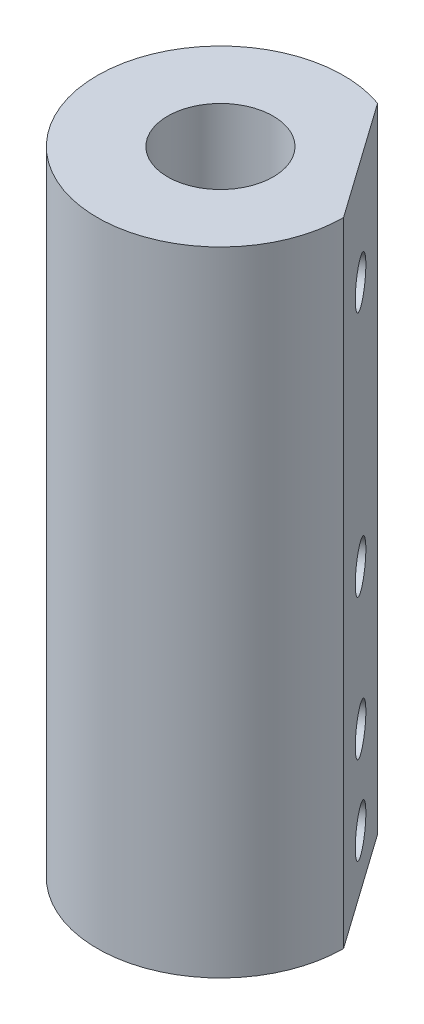
ISO-10303-21;
HEADER;
FILE_DESCRIPTION(('STEP AP214'),'2;1');
FILE_NAME('part.step','',(''),(''),'','','');
FILE_SCHEMA(('AUTOMOTIVE_DESIGN { 1 0 10303 214 1 1 1 1 }'));
ENDSEC;
DATA;
#1=APPLICATION_CONTEXT('core data for automotive mechanical design processes');
#2=APPLICATION_PROTOCOL_DEFINITION('international standard','automotive_design',2000,#1);
#3=PRODUCT_CONTEXT('',#1,'mechanical');
#4=PRODUCT('Part','Part','',(#3));
#5=PRODUCT_RELATED_PRODUCT_CATEGORY('part','',(#4));
#6=PRODUCT_DEFINITION_FORMATION('','',#4);
#7=PRODUCT_DEFINITION_CONTEXT('part definition',#1,'design');
#8=PRODUCT_DEFINITION('design','',#6,#7);
#9=PRODUCT_DEFINITION_SHAPE('','',#8);
#10=(LENGTH_UNIT() NAMED_UNIT(*) SI_UNIT(.MILLI.,.METRE.));
#11=(NAMED_UNIT(*) PLANE_ANGLE_UNIT() SI_UNIT($,.RADIAN.));
#12=(NAMED_UNIT(*) SI_UNIT($,.STERADIAN.) SOLID_ANGLE_UNIT());
#13=UNCERTAINTY_MEASURE_WITH_UNIT(LENGTH_MEASURE(1.E-05),#10,'distance_accuracy_value','');
#14=(GEOMETRIC_REPRESENTATION_CONTEXT(3) GLOBAL_UNCERTAINTY_ASSIGNED_CONTEXT((#13)) GLOBAL_UNIT_ASSIGNED_CONTEXT((#10,
#11,#12)) REPRESENTATION_CONTEXT('',''));
#15=CARTESIAN_POINT('',(0.,0.,0.));
#16=DIRECTION('',(0.,0.,1.));
#17=DIRECTION('',(1.,0.,0.));
#18=AXIS2_PLACEMENT_3D('',#15,#16,#17);
#19=CARTESIAN_POINT('',(0.,57.15,0.));
#20=DIRECTION('',(0.,-1.,0.));
#21=DIRECTION('',(0.,0.,-1.));
#22=AXIS2_PLACEMENT_3D('',#19,#20,#21);
#23=CYLINDRICAL_SURFACE('',#22,3.175);
#24=CARTESIAN_POINT('',(0.879250836057139,12.7,-3.0508266039375));
#25=CARTESIAN_POINT('',(0.879266784529314,12.7986159473622,-3.05082741825468));
#26=CARTESIAN_POINT('',(0.888428439740588,12.8973863136503,-3.04822737365737));
#27=CARTESIAN_POINT('',(0.923910178826769,13.091598658126,-3.03765206808218));
#28=CARTESIAN_POINT('',(0.950276878018773,13.1870308496049,-3.02966220193752));
#29=CARTESIAN_POINT('',(1.01694977886354,13.3711669372845,-3.00793000143587));
#30=CARTESIAN_POINT('',(1.05713499111702,13.4599213412824,-2.99423738531754));
#31=CARTESIAN_POINT('',(1.14830461055607,13.6302890678506,-2.9604696740733));
#32=CARTESIAN_POINT('',(1.19928931231204,13.7119021955473,-2.94039440484457));
#33=CARTESIAN_POINT('',(1.31664450245552,13.8777109327323,-2.88992633161334));
#34=CARTESIAN_POINT('',(1.3841614711888,13.9607841510718,-2.85851068301641));
#35=CARTESIAN_POINT('',(1.52607451934385,14.1158637848927,-2.78533787167219));
#36=CARTESIAN_POINT('',(1.60047650304798,14.1878605581883,-2.74357178037398));
#37=CARTESIAN_POINT('',(1.76228841849776,14.3273519414227,-2.64293235087655));
#38=CARTESIAN_POINT('',(1.85018477727017,14.3932555481156,-2.58260305190722));
#39=CARTESIAN_POINT('',(2.02622061822568,14.5067737625616,-2.44690798700951));
#40=CARTESIAN_POINT('',(2.11435977201634,14.5544064793801,-2.37155722269306));
#41=CARTESIAN_POINT('',(2.27732897128609,14.6248156680887,-2.21491374353619));
#42=CARTESIAN_POINT('',(2.35260108756851,14.6496268735302,-2.13500398755379));
#43=CARTESIAN_POINT('',(2.49583254065029,14.6806159105589,-1.96562906684928));
#44=CARTESIAN_POINT('',(2.56379949232779,14.6868133303414,-1.87617404983686));
#45=CARTESIAN_POINT('',(2.68105369073802,14.6806353432718,-1.70352281645355));
#46=CARTESIAN_POINT('',(2.73162369725391,14.6706409401224,-1.62109787251304));
#47=CARTESIAN_POINT('',(2.82401535494036,14.6369611623231,-1.45418662193724));
#48=CARTESIAN_POINT('',(2.86583634456912,14.6132747528852,-1.36970015996277));
#49=CARTESIAN_POINT('',(2.94051987378886,14.5532415070335,-1.2010443984891));
#50=CARTESIAN_POINT('',(2.97335910629797,14.5168622793237,-1.11687647274812));
#51=CARTESIAN_POINT('',(3.0303869763192,14.4328058510239,-0.951343288549882));
#52=CARTESIAN_POINT('',(3.05457363988127,14.3851260765079,-0.869978673445757));
#53=CARTESIAN_POINT('',(3.09774714873017,14.2731677875432,-0.702138099001987));
#54=CARTESIAN_POINT('',(3.11571231445628,14.2075620300607,-0.616286143258725));
#55=CARTESIAN_POINT('',(3.14362236637916,14.0650398463811,-0.452932923975716));
#56=CARTESIAN_POINT('',(3.1535554585757,13.9881069829628,-0.37544408456706));
#57=CARTESIAN_POINT('',(3.16828033405091,13.8133048236951,-0.222032336448539));
#58=CARTESIAN_POINT('',(3.17223132034705,13.7140134331351,-0.147635389316901));
#59=CARTESIAN_POINT('',(3.17562165900396,13.5038367850943,-0.0174781506000808));
#60=CARTESIAN_POINT('',(3.17506936332696,13.3929733665289,0.0383164415941777));
#61=CARTESIAN_POINT('',(3.17310443267602,13.1924910728781,0.11438178712268));
#62=CARTESIAN_POINT('',(3.17195628892221,13.1049538468026,0.140136162555728));
#63=CARTESIAN_POINT('',(3.17014106555317,12.926829637871,0.176567343436816));
#64=CARTESIAN_POINT('',(3.16947332934425,12.8362469953517,0.187264747107328));
#65=CARTESIAN_POINT('',(3.16915525520783,12.6543932196396,0.192587434728846));
#66=CARTESIAN_POINT('',(3.16950724874707,12.563120985331,0.187175887080329));
#67=CARTESIAN_POINT('',(3.17095413282316,12.382848327613,0.160745728688529));
#68=CARTESIAN_POINT('',(3.17204963851579,12.2938498487465,0.139714193157351));
#69=CARTESIAN_POINT('',(3.17399673251353,12.1218033156128,0.0843306899287901));
#70=CARTESIAN_POINT('',(3.17485204397106,12.0386813560861,0.0502040171406935));
#71=CARTESIAN_POINT('',(3.17511335816301,11.8780126063908,-0.0292420249921355));
#72=CARTESIAN_POINT('',(3.17451884589173,11.8004678074111,-0.0745653664729504));
#73=CARTESIAN_POINT('',(3.17022370171469,11.6374766628064,-0.183949204004283));
#74=CARTESIAN_POINT('',(3.16595325039273,11.5533367782666,-0.249934168104891));
#75=CARTESIAN_POINT('',(3.15149296269693,11.3947812292528,-0.392228879682924));
#76=CARTESIAN_POINT('',(3.14129695891541,11.3203757955474,-0.468549320912708));
#77=CARTESIAN_POINT('',(3.11083966016658,11.1712640965889,-0.642061000534193));
#78=CARTESIAN_POINT('',(3.0892270035168,11.0984211657503,-0.74063674743561));
#79=CARTESIAN_POINT('',(3.03299369059539,10.969516015147,-0.944864305588989));
#80=CARTESIAN_POINT('',(2.99837914788612,10.9134459309168,-1.05051277205095));
#81=CARTESIAN_POINT('',(2.91703988156128,10.8235829514658,-1.25824576975895));
#82=CARTESIAN_POINT('',(2.87116228675439,10.7886591972276,-1.36016609156136));
#83=CARTESIAN_POINT('',(2.76645998043745,10.7382839134688,-1.56211304286242));
#84=CARTESIAN_POINT('',(2.70765331865101,10.7228054375042,-1.66214210331118));
#85=CARTESIAN_POINT('',(2.588340373134,10.7131698994384,-1.84146076351314));
#86=CARTESIAN_POINT('',(2.52936587691776,10.7162032043507,-1.9216324020801));
#87=CARTESIAN_POINT('',(2.40520389137406,10.7369954090218,-2.07493127227239));
#88=CARTESIAN_POINT('',(2.34001668408742,10.754753640589,-2.14805882337811));
#89=CARTESIAN_POINT('',(2.20820266007952,10.8031922538666,-2.28321758813869));
#90=CARTESIAN_POINT('',(2.14170424532295,10.8334029582987,-2.34554574837234));
#91=CARTESIAN_POINT('',(2.00742988075185,10.9054263859605,-2.46144769940214));
#92=CARTESIAN_POINT('',(1.93965371719987,10.947241066605,-2.5150200107946));
#93=CARTESIAN_POINT('',(1.79793813944995,11.0460799191486,-2.61849554678933));
#94=CARTESIAN_POINT('',(1.72408918629089,11.1042322703439,-2.6674407903706));
#95=CARTESIAN_POINT('',(1.58001210786371,11.2316841506532,-2.75523517905275));
#96=CARTESIAN_POINT('',(1.5097881877097,11.3009962578905,-2.79407280111226));
#97=CARTESIAN_POINT('',(1.36599258772645,11.4603470664065,-2.86741990888726));
#98=CARTESIAN_POINT('',(1.29339737815488,11.5519332479684,-2.9004986147314));
#99=CARTESIAN_POINT('',(1.1610448291027,11.7469359072912,-2.95596904458384));
#100=CARTESIAN_POINT('',(1.10128039486569,11.8503457984159,-2.97836668308249));
#101=CARTESIAN_POINT('',(1.01124419595411,12.0434143940884,-3.00994474730846));
#102=CARTESIAN_POINT('',(0.977376977845873,12.1310966433961,-3.02094856192834));
#103=CARTESIAN_POINT('',(0.923724008546756,12.3110137287571,-3.0377901604856));
#104=CARTESIAN_POINT('',(0.903893695824818,12.4032331548509,-3.04364430704542));
#105=CARTESIAN_POINT('',(0.8878396493226,12.5301859566324,-3.04834033029344));
#106=CARTESIAN_POINT('',(0.884626868723532,12.5640530810083,-3.04927310197062));
#107=CARTESIAN_POINT('',(0.88032944206554,12.6319406468529,-3.05051617652381));
#108=CARTESIAN_POINT('',(0.879245331186276,12.6659611247227,-3.05082632286287));
#109=CARTESIAN_POINT('',(0.879250836057139,12.7,-3.0508266039375));
#110=B_SPLINE_CURVE_WITH_KNOTS('',3,(#24,#25,#26,#27,#28,#29,#30,#31,#32,#33,#34,#35,#36,#37,
#38,#39,#40,#41,#42,#43,#44,#45,#46,#47,#48,#49,#50,#51,#52,#53,#54,#55,#56,#57,#58,#59,#60,#61,
#62,#63,#64,#65,#66,#67,#68,#69,#70,#71,#72,#73,#74,#75,#76,#77,#78,#79,#80,#81,#82,#83,#84,#85,
#86,#87,#88,#89,#90,#91,#92,#93,#94,#95,#96,#97,#98,#99,#100,#101,#102,#103,#104,#105,#106,#107,
#108,#109),.UNSPECIFIED.,.T.,.F.,(4,2,2,2,2,2,2,2,2,2,2,2,2,2,2,2,2,2,2,2,2,2,2,2,2,2,2,2,2,2,2,
2,2,2,2,2,2,2,2,2,2,2,4),(0.,0.295691629869093,0.592187751355433,0.886151320357079,
1.18012290863727,1.51353235431121,1.84723041459194,2.2211861220471,2.59477022223586,
2.93037280344453,3.26562208971673,3.55587807338832,3.84615599633815,4.13718017536214,
4.4282707047848,4.75558651420979,5.08338207375704,5.45398432824924,5.82389940591808,
6.0965203107798,6.36876790139626,6.64163843822727,6.91473501419682,7.18332974598516,
7.45201990176381,7.77186554609134,8.09204468848396,8.46354350377218,8.83486785638387,
9.18400627788152,9.53266034251656,9.82985717424189,10.1270405204293,10.413913784722,
10.7008354696319,11.0175380377569,11.3346000917526,11.6973638515929,12.0599265021986,
12.3427633235734,12.6246981751993,12.7267352315088,12.8287979381894),.UNSPECIFIED.);
#111=CARTESIAN_POINT('',(0.879250836057139,12.7,-3.0508266039375));
#112=VERTEX_POINT('',#111);
#113=EDGE_CURVE('E131',#112,#112,#110,.T.);
#114=ORIENTED_EDGE('',*,*,#113,.T.);
#115=EDGE_LOOP('',(#114));
#116=FACE_BOUND('',#115,.T.);
#117=CARTESIAN_POINT('',(0.879250836057139,4.7625,-3.0508266039375));
#118=CARTESIAN_POINT('',(0.879266784529316,4.86111594736216,-3.05082741825468));
#119=CARTESIAN_POINT('',(0.888428439740587,4.9598863136503,-3.04822737365737));
#120=CARTESIAN_POINT('',(0.923910178826767,5.15409865812604,-3.03765206808218));
#121=CARTESIAN_POINT('',(0.950276878018773,5.24953084960485,-3.02966220193752));
#122=CARTESIAN_POINT('',(1.01694977886354,5.43366693728446,-3.00793000143587));
#123=CARTESIAN_POINT('',(1.05713499111702,5.52242134128243,-2.99423738531754));
#124=CARTESIAN_POINT('',(1.14830461055607,5.69278906785063,-2.9604696740733));
#125=CARTESIAN_POINT('',(1.19928931231204,5.77440219554727,-2.94039440484457));
#126=CARTESIAN_POINT('',(1.31664450245552,5.94021093273228,-2.88992633161334));
#127=CARTESIAN_POINT('',(1.3841614711888,6.02328415107181,-2.85851068301641));
#128=CARTESIAN_POINT('',(1.52607451934385,6.1783637848927,-2.78533787167219));
#129=CARTESIAN_POINT('',(1.60047650304798,6.25036055818829,-2.74357178037398));
#130=CARTESIAN_POINT('',(1.76228841849776,6.3898519414227,-2.64293235087655));
#131=CARTESIAN_POINT('',(1.85018477727017,6.45575554811563,-2.58260305190722));
#132=CARTESIAN_POINT('',(2.02622061822568,6.56927376256155,-2.44690798700951));
#133=CARTESIAN_POINT('',(2.11435977201634,6.61690647938015,-2.37155722269305));
#134=CARTESIAN_POINT('',(2.27732897128609,6.68731566808873,-2.21491374353619));
#135=CARTESIAN_POINT('',(2.35260108756851,6.71212687353016,-2.13500398755378));
#136=CARTESIAN_POINT('',(2.4958325406503,6.7431159105589,-1.96562906684928));
#137=CARTESIAN_POINT('',(2.56379949232779,6.74931333034136,-1.87617404983686));
#138=CARTESIAN_POINT('',(2.68105369073802,6.7431353432718,-1.70352281645355));
#139=CARTESIAN_POINT('',(2.73162369725392,6.73314094012237,-1.62109787251304));
#140=CARTESIAN_POINT('',(2.82401535494036,6.69946116232315,-1.45418662193724));
#141=CARTESIAN_POINT('',(2.86583634456912,6.67577475288519,-1.36970015996277));
#142=CARTESIAN_POINT('',(2.94051987378886,6.61574150703353,-1.2010443984891));
#143=CARTESIAN_POINT('',(2.97335910629797,6.57936227932369,-1.11687647274812));
#144=CARTESIAN_POINT('',(3.0303869763192,6.49530585102387,-0.95134328854988));
#145=CARTESIAN_POINT('',(3.05457363988127,6.44762607650793,-0.869978673445756));
#146=CARTESIAN_POINT('',(3.09774714873017,6.33566778754317,-0.702138099001986));
#147=CARTESIAN_POINT('',(3.11571231445628,6.27006203006067,-0.616286143258725));
#148=CARTESIAN_POINT('',(3.14362236637916,6.12753984638114,-0.452932923975716));
#149=CARTESIAN_POINT('',(3.1535554585757,6.05060698296281,-0.37544408456706));
#150=CARTESIAN_POINT('',(3.16828033405091,5.87580482369513,-0.222032336448539));
#151=CARTESIAN_POINT('',(3.17223132034705,5.77651343313507,-0.147635389316901));
#152=CARTESIAN_POINT('',(3.17562165900396,5.56633678509435,-0.0174781506000804));
#153=CARTESIAN_POINT('',(3.17506936332696,5.45547336652889,0.0383164415941787));
#154=CARTESIAN_POINT('',(3.17310443267602,5.25499107287811,0.114381787122681));
#155=CARTESIAN_POINT('',(3.17195628892221,5.16745384680261,0.14013616255573));
#156=CARTESIAN_POINT('',(3.17014106555317,4.98932963787095,0.176567343436817));
#157=CARTESIAN_POINT('',(3.16947332934425,4.89874699535174,0.187264747107328));
#158=CARTESIAN_POINT('',(3.16915525520783,4.71689321963955,0.192587434728846));
#159=CARTESIAN_POINT('',(3.16950724874707,4.62562098533095,0.18717588708033));
#160=CARTESIAN_POINT('',(3.17095413282316,4.44534832761297,0.160745728688528));
#161=CARTESIAN_POINT('',(3.17204963851579,4.35634984874647,0.13971419315735));
#162=CARTESIAN_POINT('',(3.17399673251353,4.18430331561277,0.0843306899287897));
#163=CARTESIAN_POINT('',(3.17485204397106,4.1011813560861,0.0502040171406944));
#164=CARTESIAN_POINT('',(3.17511335816301,3.94051260639077,-0.0292420249921349));
#165=CARTESIAN_POINT('',(3.17451884589173,3.86296780741105,-0.0745653664729514));
#166=CARTESIAN_POINT('',(3.17022370171469,3.69997666280637,-0.183949204004286));
#167=CARTESIAN_POINT('',(3.16595325039273,3.61583677826662,-0.249934168104893));
#168=CARTESIAN_POINT('',(3.15149296269693,3.45728122925278,-0.392228879682926));
#169=CARTESIAN_POINT('',(3.14129695891541,3.38287579554741,-0.46854932091271));
#170=CARTESIAN_POINT('',(3.11083966016658,3.23376409658892,-0.642061000534195));
#171=CARTESIAN_POINT('',(3.0892270035168,3.16092116575025,-0.740636747435613));
#172=CARTESIAN_POINT('',(3.03299369059539,3.03201601514703,-0.944864305588993));
#173=CARTESIAN_POINT('',(2.99837914788612,2.9759459309168,-1.05051277205095));
#174=CARTESIAN_POINT('',(2.91703988156128,2.88608295146577,-1.25824576975896));
#175=CARTESIAN_POINT('',(2.87116228675439,2.85115919722763,-1.36016609156137));
#176=CARTESIAN_POINT('',(2.76645998043744,2.80078391346876,-1.56211304286242));
#177=CARTESIAN_POINT('',(2.70765331865101,2.78530543750422,-1.66214210331118));
#178=CARTESIAN_POINT('',(2.588340373134,2.77566989943843,-1.84146076351315));
#179=CARTESIAN_POINT('',(2.52936587691776,2.77870320435067,-1.9216324020801));
#180=CARTESIAN_POINT('',(2.40520389137405,2.79949540902177,-2.07493127227239));
#181=CARTESIAN_POINT('',(2.34001668408742,2.81725364058905,-2.14805882337812));
#182=CARTESIAN_POINT('',(2.20820266007952,2.86569225386662,-2.28321758813869));
#183=CARTESIAN_POINT('',(2.14170424532295,2.89590295829874,-2.34554574837235));
#184=CARTESIAN_POINT('',(2.00742988075185,2.96792638596049,-2.46144769940215));
#185=CARTESIAN_POINT('',(1.93965371719987,3.00974106660504,-2.5150200107946));
#186=CARTESIAN_POINT('',(1.79793813944995,3.10857991914858,-2.61849554678933));
#187=CARTESIAN_POINT('',(1.72408918629088,3.16673227034394,-2.6674407903706));
#188=CARTESIAN_POINT('',(1.5800121078637,3.29418415065323,-2.75523517905275));
#189=CARTESIAN_POINT('',(1.5097881877097,3.3634962578905,-2.79407280111226));
#190=CARTESIAN_POINT('',(1.36599258772644,3.52284706640652,-2.86741990888726));
#191=CARTESIAN_POINT('',(1.29339737815488,3.61443324796844,-2.9004986147314));
#192=CARTESIAN_POINT('',(1.1610448291027,3.80943590729116,-2.95596904458384));
#193=CARTESIAN_POINT('',(1.10128039486568,3.91284579841591,-2.9783666830825));
#194=CARTESIAN_POINT('',(1.01124419595411,4.10591439408846,-3.00994474730846));
#195=CARTESIAN_POINT('',(0.97737697784587,4.1935966433961,-3.02094856192834));
#196=CARTESIAN_POINT('',(0.923724008546754,4.37351372875715,-3.0377901604856));
#197=CARTESIAN_POINT('',(0.903893695824818,4.46573315485093,-3.04364430704542));
#198=CARTESIAN_POINT('',(0.887839649322598,4.59268595663237,-3.04834033029344));
#199=CARTESIAN_POINT('',(0.884626868723529,4.62655308100829,-3.04927310197062));
#200=CARTESIAN_POINT('',(0.880329442065538,4.69444064685289,-3.05051617652381));
#201=CARTESIAN_POINT('',(0.879245331186275,4.72846112472269,-3.05082632286287));
#202=CARTESIAN_POINT('',(0.879250836057139,4.7625,-3.0508266039375));
#203=B_SPLINE_CURVE_WITH_KNOTS('',3,(#117,#118,#119,#120,#121,#122,#123,#124,#125,#126,#127,
#128,#129,#130,#131,#132,#133,#134,#135,#136,#137,#138,#139,#140,#141,#142,#143,#144,#145,#146,
#147,#148,#149,#150,#151,#152,#153,#154,#155,#156,#157,#158,#159,#160,#161,#162,#163,#164,#165,
#166,#167,#168,#169,#170,#171,#172,#173,#174,#175,#176,#177,#178,#179,#180,#181,#182,#183,#184,
#185,#186,#187,#188,#189,#190,#191,#192,#193,#194,#195,#196,#197,#198,#199,#200,#201,#202),
.UNSPECIFIED.,.T.,.F.,(4,2,2,2,2,2,2,2,2,2,2,2,2,2,2,2,2,2,2,2,2,2,2,2,2,2,2,2,2,2,2,2,2,2,2,2,
2,2,2,2,2,2,4),(0.,0.295691629869095,0.592187751355434,0.886151320357078,1.18012290863726,
1.51353235431121,1.84723041459194,2.2211861220471,2.59477022223586,2.93037280344453,
3.26562208971673,3.55587807338832,3.84615599633815,4.13718017536214,4.4282707047848,
4.75558651420979,5.08338207375704,5.45398432824924,5.82389940591809,6.0965203107798,
6.36876790139627,6.64163843822727,6.91473501419682,7.18332974598516,7.45201990176382,
7.77186554609134,8.09204468848397,8.46354350377218,8.83486785638388,9.18400627788152,
9.53266034251656,9.82985717424189,10.1270405204293,10.413913784722,10.7008354696319,
11.0175380377569,11.3346000917526,11.6973638515929,12.0599265021986,12.3427633235734,
12.6246981751993,12.7267352315088,12.8287979381894),.UNSPECIFIED.);
#204=CARTESIAN_POINT('',(0.879250836057139,4.7625,-3.0508266039375));
#205=VERTEX_POINT('',#204);
#206=EDGE_CURVE('E121',#205,#205,#203,.T.);
#207=ORIENTED_EDGE('',*,*,#206,.T.);
#208=EDGE_LOOP('',(#207));
#209=FACE_BOUND('',#208,.T.);
#210=CARTESIAN_POINT('',(0.,0.,0.));
#211=DIRECTION('',(0.,1.,0.));
#212=DIRECTION('',(0.,0.,1.));
#213=AXIS2_PLACEMENT_3D('',#210,#211,#212);
#214=CIRCLE('',#213,3.175);
#215=CARTESIAN_POINT('',(0.,0.,3.175));
#216=VERTEX_POINT('',#215);
#217=EDGE_CURVE('E68',#216,#216,#214,.T.);
#218=ORIENTED_EDGE('',*,*,#217,.F.);
#219=EDGE_LOOP('',(#218));
#220=FACE_BOUND('',#219,.T.);
#221=CARTESIAN_POINT('',(0.,19.05,0.));
#222=DIRECTION('',(0.,1.,0.));
#223=DIRECTION('',(0.,0.,1.));
#224=AXIS2_PLACEMENT_3D('',#221,#222,#223);
#225=CIRCLE('',#224,3.175);
#226=CARTESIAN_POINT('',(0.,19.05,3.175));
#227=VERTEX_POINT('',#226);
#228=EDGE_CURVE('E36',#227,#227,#225,.T.);
#229=ORIENTED_EDGE('',*,*,#228,.T.);
#230=EDGE_LOOP('',(#229));
#231=FACE_BOUND('',#230,.T.);
#232=ADVANCED_FACE('F32',(#116,#209,#220,#231),#23,.F.);
#233=CARTESIAN_POINT('',(0.,57.15,0.));
#234=DIRECTION('',(0.,1.,0.));
#235=DIRECTION('',(0.,0.,1.));
#236=AXIS2_PLACEMENT_3D('',#233,#234,#235);
#237=PLANE('',#236);
#238=CARTESIAN_POINT('',(0.,57.15,0.));
#239=DIRECTION('',(0.,1.,0.));
#240=DIRECTION('',(0.,0.,1.));
#241=AXIS2_PLACEMENT_3D('',#238,#239,#240);
#242=CIRCLE('',#241,4.7625);
#243=CARTESIAN_POINT('',(0.,57.15,4.7625));
#244=VERTEX_POINT('',#243);
#245=EDGE_CURVE('E90',#244,#244,#242,.T.);
#246=ORIENTED_EDGE('',*,*,#245,.F.);
#247=EDGE_LOOP('',(#246));
#248=FACE_BOUND('',#247,.T.);
#249=CARTESIAN_POINT('',(0.,57.15,0.));
#250=DIRECTION('',(0.,1.,0.));
#251=DIRECTION('',(0.,0.,1.));
#252=AXIS2_PLACEMENT_3D('',#249,#250,#251);
#253=CIRCLE('',#252,11.1125);
#254=CARTESIAN_POINT('',(3.71279768538664,57.15,-10.4739099479319));
#255=VERTEX_POINT('',#254);
#256=CARTESIAN_POINT('',(11.1125,57.15,0.));
#257=VERTEX_POINT('',#256);
#258=EDGE_CURVE('E11',#255,#257,#253,.T.);
#259=ORIENTED_EDGE('',*,*,#258,.T.);
#260=DIRECTION('',(0.577013852549787,0.,0.816734359486396));
#261=VECTOR('',#260,1.);
#262=CARTESIAN_POINT('',(3.71279768538664,57.15,-10.4739099479319));
#263=LINE('',#262,#261);
#264=EDGE_CURVE('E65',#255,#257,#263,.T.);
#265=ORIENTED_EDGE('',*,*,#264,.F.);
#266=EDGE_LOOP('',(#259,#265));
#267=FACE_BOUND('',#266,.T.);
#268=ADVANCED_FACE('F66',(#248,#267),#237,.T.);
#269=CARTESIAN_POINT('',(0.,57.15,0.));
#270=DIRECTION('',(0.,-1.,0.));
#271=DIRECTION('',(0.,0.,-1.));
#272=AXIS2_PLACEMENT_3D('',#269,#270,#271);
#273=CYLINDRICAL_SURFACE('',#272,11.1125);
#274=DIRECTION('',(0.,-1.,0.));
#275=VECTOR('',#274,1.);
#276=CARTESIAN_POINT('',(11.1125,138.678596880941,0.));
#277=LINE('',#276,#275);
#278=CARTESIAN_POINT('',(11.1125,0.,0.));
#279=VERTEX_POINT('',#278);
#280=EDGE_CURVE('E62',#257,#279,#277,.T.);
#281=ORIENTED_EDGE('',*,*,#280,.F.);
#282=ORIENTED_EDGE('',*,*,#258,.F.);
#283=DIRECTION('',(0.,-1.,0.));
#284=VECTOR('',#283,1.);
#285=CARTESIAN_POINT('',(3.71279768538664,138.678596880941,-10.4739099479319));
#286=LINE('',#285,#284);
#287=CARTESIAN_POINT('',(3.71279768538664,0.,-10.4739099479319));
#288=VERTEX_POINT('',#287);
#289=EDGE_CURVE('E49',#255,#288,#286,.T.);
#290=ORIENTED_EDGE('',*,*,#289,.T.);
#291=CARTESIAN_POINT('',(0.,0.,0.));
#292=DIRECTION('',(0.,1.,0.));
#293=DIRECTION('',(0.,0.,1.));
#294=AXIS2_PLACEMENT_3D('',#291,#292,#293);
#295=CIRCLE('',#294,11.1125);
#296=EDGE_CURVE('E41',#288,#279,#295,.T.);
#297=ORIENTED_EDGE('',*,*,#296,.T.);
#298=EDGE_LOOP('',(#281,#282,#290,#297));
#299=FACE_BOUND('',#298,.T.);
#300=ADVANCED_FACE('F34',(#299),#273,.T.);
#301=CARTESIAN_POINT('',(0.,0.,0.));
#302=DIRECTION('',(0.,1.,0.));
#303=DIRECTION('',(0.,0.,1.));
#304=AXIS2_PLACEMENT_3D('',#301,#302,#303);
#305=PLANE('',#304);
#306=ORIENTED_EDGE('',*,*,#296,.F.);
#307=DIRECTION('',(0.577013852549787,0.,0.816734359486396));
#308=VECTOR('',#307,1.);
#309=CARTESIAN_POINT('',(3.71279768538664,0.,-10.4739099479319));
#310=LINE('',#309,#308);
#311=EDGE_CURVE('E55',#288,#279,#310,.T.);
#312=ORIENTED_EDGE('',*,*,#311,.T.);
#313=EDGE_LOOP('',(#306,#312));
#314=FACE_BOUND('',#313,.T.);
#315=ORIENTED_EDGE('',*,*,#217,.T.);
#316=EDGE_LOOP('',(#315));
#317=FACE_BOUND('',#316,.T.);
#318=ADVANCED_FACE('F76',(#314,#317),#305,.F.);
#319=CARTESIAN_POINT('',(3.71279768538664,138.678596880941,-10.4739099479319));
#320=DIRECTION('',(0.816734359486396,0.,-0.577013852549787));
#321=DIRECTION('',(-0.577013852549787,0.,-0.816734359486396));
#322=AXIS2_PLACEMENT_3D('',#319,#320,#321);
#323=PLANE('',#322);
#324=CARTESIAN_POINT('',(7.41264884269332,25.4,-5.23695497396597));
#325=DIRECTION('',(0.816734359486396,0.,-0.577013852549787));
#326=DIRECTION('',(-0.577013852549787,0.,-0.816734359486396));
#327=AXIS2_PLACEMENT_3D('',#324,#325,#326);
#328=CIRCLE('',#327,1.984375);
#329=CARTESIAN_POINT('',(6.26763697903984,25.4,-6.85766221857178));
#330=VERTEX_POINT('',#329);
#331=EDGE_CURVE('E108',#330,#330,#328,.T.);
#332=ORIENTED_EDGE('',*,*,#331,.F.);
#333=EDGE_LOOP('',(#332));
#334=FACE_BOUND('',#333,.T.);
#335=CARTESIAN_POINT('',(7.41264884269332,12.7,-5.23695497396597));
#336=DIRECTION('',(0.816734359486396,0.,-0.577013852549787));
#337=DIRECTION('',(-0.577013852549787,0.,-0.816734359486396));
#338=AXIS2_PLACEMENT_3D('',#335,#336,#337);
#339=CIRCLE('',#338,1.984375);
#340=CARTESIAN_POINT('',(6.26763697903984,12.7,-6.85766221857178));
#341=VERTEX_POINT('',#340);
#342=EDGE_CURVE('E127',#341,#341,#339,.T.);
#343=ORIENTED_EDGE('',*,*,#342,.F.);
#344=EDGE_LOOP('',(#343));
#345=FACE_BOUND('',#344,.T.);
#346=CARTESIAN_POINT('',(7.41264884269332,4.7625,-5.23695497396597));
#347=DIRECTION('',(0.816734359486396,0.,-0.577013852549787));
#348=DIRECTION('',(-0.577013852549787,0.,-0.816734359486396));
#349=AXIS2_PLACEMENT_3D('',#346,#347,#348);
#350=CIRCLE('',#349,1.984375);
#351=CARTESIAN_POINT('',(6.26763697903984,4.7625,-6.85766221857178));
#352=VERTEX_POINT('',#351);
#353=EDGE_CURVE('E109',#352,#352,#350,.T.);
#354=ORIENTED_EDGE('',*,*,#353,.F.);
#355=EDGE_LOOP('',(#354));
#356=FACE_BOUND('',#355,.T.);
#357=CARTESIAN_POINT('',(7.41264884269332,47.625,-5.23695497396597));
#358=DIRECTION('',(0.816734359486396,0.,-0.577013852549787));
#359=DIRECTION('',(-0.577013852549787,0.,-0.816734359486396));
#360=AXIS2_PLACEMENT_3D('',#357,#358,#359);
#361=CIRCLE('',#360,1.984375);
#362=CARTESIAN_POINT('',(6.26763697903984,47.625,-6.85766221857178));
#363=VERTEX_POINT('',#362);
#364=EDGE_CURVE('E95',#363,#363,#361,.T.);
#365=ORIENTED_EDGE('',*,*,#364,.F.);
#366=EDGE_LOOP('',(#365));
#367=FACE_BOUND('',#366,.T.);
#368=ORIENTED_EDGE('',*,*,#289,.F.);
#369=ORIENTED_EDGE('',*,*,#264,.T.);
#370=ORIENTED_EDGE('',*,*,#280,.T.);
#371=ORIENTED_EDGE('',*,*,#311,.F.);
#372=EDGE_LOOP('',(#368,#369,#370,#371));
#373=FACE_BOUND('',#372,.T.);
#374=ADVANCED_FACE('F70',(#334,#345,#356,#367,#373),#323,.T.);
#375=CARTESIAN_POINT('',(0.,19.05,0.));
#376=DIRECTION('',(0.,1.,0.));
#377=DIRECTION('',(0.,0.,1.));
#378=AXIS2_PLACEMENT_3D('',#375,#376,#377);
#379=CYLINDRICAL_SURFACE('',#378,4.7625);
#380=CARTESIAN_POINT('',(2.39095388704839,25.4,-4.11882820229349));
#381=CARTESIAN_POINT('',(2.3909654080651,25.294150813182,-4.11882607553821));
#382=CARTESIAN_POINT('',(2.39908598553882,25.1881418792903,-4.11414075548458));
#383=CARTESIAN_POINT('',(2.43096088916428,24.9791765129972,-4.09538249983193));
#384=CARTESIAN_POINT('',(2.45475766883622,24.8762291653225,-4.08128407070613));
#385=CARTESIAN_POINT('',(2.51608117731363,24.6767961648988,-4.04376277704839));
#386=CARTESIAN_POINT('',(2.55355191276393,24.5802860321992,-4.02037790551555));
#387=CARTESIAN_POINT('',(2.63984544657129,24.3954945191637,-3.9642478770023));
#388=CARTESIAN_POINT('',(2.68866555927867,24.3072111989959,-3.93150493404086));
#389=CARTESIAN_POINT('',(2.79812858884,24.1358328694045,-3.85442644602069));
#390=CARTESIAN_POINT('',(2.859283197402,24.0533117391684,-3.80954100657392));
#391=CARTESIAN_POINT('',(2.98844630245902,23.9010821581149,-3.70908151973599));
#392=CARTESIAN_POINT('',(3.05645742597256,23.8313786473719,-3.65350336805317));
#393=CARTESIAN_POINT('',(3.19938658274324,23.7038363664998,-3.52911841349907));
#394=CARTESIAN_POINT('',(3.27447624677069,23.6466433521351,-3.45984239002449));
#395=CARTESIAN_POINT('',(3.42539712304839,23.5501243183105,-3.31048417908851));
#396=CARTESIAN_POINT('',(3.50122799080841,23.5107903674823,-3.23040680913609));
#397=CARTESIAN_POINT('',(3.64633656710416,23.4531861090099,-3.06546329526631));
#398=CARTESIAN_POINT('',(3.71574994076586,23.4339261842858,-2.98106321215731));
#399=CARTESIAN_POINT('',(3.84946959853199,23.4138189947159,-2.80625726774548));
#400=CARTESIAN_POINT('',(3.91377794363083,23.4129642613007,-2.71585385744743));
#401=CARTESIAN_POINT('',(4.03146795592987,23.4291731709677,-2.53759596885696));
#402=CARTESIAN_POINT('',(4.08527642355592,23.4451494845808,-2.44992120324495));
#403=CARTESIAN_POINT('',(4.18544582804018,23.4927030504419,-2.27456590527945));
#404=CARTESIAN_POINT('',(4.23180621553343,23.5242814527891,-2.18688537297734));
#405=CARTESIAN_POINT('',(4.31731514882381,23.602518264919,-2.01289454172189));
#406=CARTESIAN_POINT('',(4.3563428734145,23.6493993973065,-1.92662555766653));
#407=CARTESIAN_POINT('',(4.42650385619933,23.7566926387628,-1.75946021633644));
#408=CARTESIAN_POINT('',(4.45763431608136,23.8171095298441,-1.67856577094581));
#409=CARTESIAN_POINT('',(4.5145538062414,23.9547120923894,-1.51916761250074));
#410=CARTESIAN_POINT('',(4.53981165121677,24.0327795811446,-1.44123435339132));
#411=CARTESIAN_POINT('',(4.58304817681571,24.2009794121326,-1.29720563536337));
#412=CARTESIAN_POINT('',(4.60102405087255,24.2911163883293,-1.23111474611134));
#413=CARTESIAN_POINT('',(4.63134514615781,24.4846396206661,-1.11174433939909));
#414=CARTESIAN_POINT('',(4.64348589332845,24.5883639639738,-1.05895727001788));
#415=CARTESIAN_POINT('',(4.66241735974943,24.803863658749,-0.972246710201091));
#416=CARTESIAN_POINT('',(4.66921190562985,24.9156331890844,-0.938309732633303));
#417=CARTESIAN_POINT('',(4.67804034257101,25.1363111841819,-0.893220264838325));
#418=CARTESIAN_POINT('',(4.68035450686034,25.2449347815945,-0.880732357643936));
#419=CARTESIAN_POINT('',(4.68138266826864,25.46267209082,-0.875257978180504));
#420=CARTESIAN_POINT('',(4.68009791090915,25.5717856200272,-0.882264759147675));
#421=CARTESIAN_POINT('',(4.67396104061221,25.7800449368728,-0.914178890215989));
#422=CARTESIAN_POINT('',(4.66934258537322,25.8793816402745,-0.937911478103819));
#423=CARTESIAN_POINT('',(4.65631477758865,26.0728639331899,-1.00057756148298));
#424=CARTESIAN_POINT('',(4.64790453889526,26.1670083034689,-1.03951461000396));
#425=CARTESIAN_POINT('',(4.62612159552118,26.3518893051908,-1.13259665234938));
#426=CARTESIAN_POINT('',(4.61255381560743,26.4423127721929,-1.18731586468433));
#427=CARTESIAN_POINT('',(4.57956439462898,26.6134977833432,-1.30879867697026));
#428=CARTESIAN_POINT('',(4.560140218143,26.6942551215182,-1.37556748854192));
#429=CARTESIAN_POINT('',(4.51260766401744,26.850657714124,-1.52458880338434));
#430=CARTESIAN_POINT('',(4.48392105006231,26.9253515974049,-1.60765931024743));
#431=CARTESIAN_POINT('',(4.41752885301396,27.0596872635339,-1.78200359657099));
#432=CARTESIAN_POINT('',(4.37982260934473,27.1193279432638,-1.87327797655762));
#433=CARTESIAN_POINT('',(4.29467912700917,27.2217989272039,-2.06101289019724));
#434=CARTESIAN_POINT('',(4.24721722512188,27.2645858078123,-2.15748610172586));
#435=CARTESIAN_POINT('',(4.14279059312989,27.3313791580655,-2.35177036121944));
#436=CARTESIAN_POINT('',(4.08583154314775,27.3553968048094,-2.44958057762923));
#437=CARTESIAN_POINT('',(3.96786096488918,27.3825622734492,-2.63605843175909));
#438=CARTESIAN_POINT('',(3.90741099082464,27.3870515215784,-2.72488724025979));
#439=CARTESIAN_POINT('',(3.78104333486045,27.3786391411358,-2.89768290909763));
#440=CARTESIAN_POINT('',(3.71512661337949,27.3657405612744,-2.98165061906782));
#441=CARTESIAN_POINT('',(3.58255197022484,27.3238815998915,-3.13958495308315));
#442=CARTESIAN_POINT('',(3.51600328929436,27.2955072185123,-3.21380068842336));
#443=CARTESIAN_POINT('',(3.38231228069163,27.2241419213052,-3.35421783324423));
#444=CARTESIAN_POINT('',(3.31516984261187,27.1811482289222,-3.42041771708269));
#445=CARTESIAN_POINT('',(3.17969763186071,27.079591471391,-3.54681550007325));
#446=CARTESIAN_POINT('',(3.11145133487785,27.0204125837496,-3.60660693778306));
#447=CARTESIAN_POINT('',(2.97962965785982,26.8890641726446,-3.71625844059696));
#448=CARTESIAN_POINT('',(2.91605602420262,26.8168898266287,-3.7661148043239));
#449=CARTESIAN_POINT('',(2.7922015720823,26.6557977914269,-3.85893907911083));
#450=CARTESIAN_POINT('',(2.73243918339594,26.566074967932,-3.90120740548979));
#451=CARTESIAN_POINT('',(2.62462999980051,26.3755931007712,-3.97454238611819));
#452=CARTESIAN_POINT('',(2.57658975682631,26.2748279305198,-4.00560278046815));
#453=CARTESIAN_POINT('',(2.49574713912101,26.0652187252453,-4.05647034908745));
#454=CARTESIAN_POINT('',(2.46286384628406,25.9564212758736,-4.07633741059272));
#455=CARTESIAN_POINT('',(2.42675383002583,25.7896016000092,-4.09785941598536));
#456=CARTESIAN_POINT('',(2.41692277394191,25.7334469415344,-4.10365204579881));
#457=CARTESIAN_POINT('',(2.40183528660017,25.6203233397479,-4.11250251378692));
#458=CARTESIAN_POINT('',(2.39657562480544,25.5633550004378,-4.11556228327598));
#459=CARTESIAN_POINT('',(2.39185553825714,25.4708748742485,-4.11830444308801));
#460=CARTESIAN_POINT('',(2.39095002893183,25.4354463943185,-4.11882891449364));
#461=CARTESIAN_POINT('',(2.39095388704839,25.4,-4.11882820229349));
#462=B_SPLINE_CURVE_WITH_KNOTS('',3,(#380,#381,#382,#383,#384,#385,#386,#387,#388,#389,#390,
#391,#392,#393,#394,#395,#396,#397,#398,#399,#400,#401,#402,#403,#404,#405,#406,#407,#408,#409,
#410,#411,#412,#413,#414,#415,#416,#417,#418,#419,#420,#421,#422,#423,#424,#425,#426,#427,#428,
#429,#430,#431,#432,#433,#434,#435,#436,#437,#438,#439,#440,#441,#442,#443,#444,#445,#446,#447,
#448,#449,#450,#451,#452,#453,#454,#455,#456,#457,#458,#459,#460,#461),.UNSPECIFIED.,.T.,.F.,(4,
2,2,2,2,2,2,2,2,2,2,2,2,2,2,2,2,2,2,2,2,2,2,2,2,2,2,2,2,2,2,2,2,2,2,2,2,2,2,2,4),(0.,
0.317423342777007,0.635709869424454,0.952707410291477,1.26963001494829,1.60443610771163,
1.93937096980108,2.28883331567455,2.6381403100514,2.96926961989999,3.30026455957215,
3.61111546389085,3.9219892858299,4.23760605741105,4.55333450873194,4.89131819303119,
5.2294320170067,5.57865828748477,5.92763436564339,6.25396860567011,6.58018992128785,
6.88552567948328,7.19093283230976,7.50927388829592,7.82775296268549,8.17215889598376,
8.5165900604721,8.86190293210255,9.20701001251522,9.52799458217558,9.84892287903786,
10.1584667137617,10.4680693710932,10.7916640724684,11.1153791067088,11.4611217772313,
11.8070572555398,12.1511238721055,12.3228267847975,12.4944082586831,12.6007058440705),.UNSPECIFIED.);
#463=CARTESIAN_POINT('',(2.39095388704839,25.4,-4.11882820229349));
#464=VERTEX_POINT('',#463);
#465=EDGE_CURVE('E130',#464,#464,#462,.T.);
#466=ORIENTED_EDGE('',*,*,#465,.F.);
#467=EDGE_LOOP('',(#466));
#468=FACE_BOUND('',#467,.T.);
#469=CARTESIAN_POINT('',(2.39095388704839,47.625,-4.11882820229349));
#470=CARTESIAN_POINT('',(2.39096540806509,47.519150813182,-4.11882607553821));
#471=CARTESIAN_POINT('',(2.39908598553882,47.4131418792903,-4.11414075548458));
#472=CARTESIAN_POINT('',(2.43096088916428,47.2041765129972,-4.09538249983193));
#473=CARTESIAN_POINT('',(2.45475766883622,47.1012291653225,-4.08128407070613));
#474=CARTESIAN_POINT('',(2.51608117731364,46.9017961648988,-4.04376277704839));
#475=CARTESIAN_POINT('',(2.55355191276393,46.8052860321992,-4.02037790551554));
#476=CARTESIAN_POINT('',(2.63984544657129,46.6204945191637,-3.9642478770023));
#477=CARTESIAN_POINT('',(2.68866555927867,46.5322111989959,-3.93150493404086));
#478=CARTESIAN_POINT('',(2.79812858884001,46.3608328694045,-3.85442644602069));
#479=CARTESIAN_POINT('',(2.859283197402,46.2783117391684,-3.80954100657392));
#480=CARTESIAN_POINT('',(2.98844630245903,46.1260821581149,-3.70908151973599));
#481=CARTESIAN_POINT('',(3.05645742597256,46.0563786473719,-3.65350336805317));
#482=CARTESIAN_POINT('',(3.19938658274324,45.9288363664998,-3.52911841349907));
#483=CARTESIAN_POINT('',(3.27447624677069,45.8716433521351,-3.45984239002449));
#484=CARTESIAN_POINT('',(3.42539712304839,45.7751243183105,-3.31048417908851));
#485=CARTESIAN_POINT('',(3.50122799080841,45.7357903674823,-3.23040680913609));
#486=CARTESIAN_POINT('',(3.64633656710416,45.6781861090099,-3.06546329526631));
#487=CARTESIAN_POINT('',(3.71574994076586,45.6589261842859,-2.98106321215731));
#488=CARTESIAN_POINT('',(3.849469598532,45.6388189947159,-2.80625726774548));
#489=CARTESIAN_POINT('',(3.91377794363083,45.6379642613007,-2.71585385744743));
#490=CARTESIAN_POINT('',(4.03146795592987,45.6541731709677,-2.53759596885696));
#491=CARTESIAN_POINT('',(4.08527642355592,45.6701494845808,-2.44992120324495));
#492=CARTESIAN_POINT('',(4.18544582804018,45.7177030504419,-2.27456590527945));
#493=CARTESIAN_POINT('',(4.23180621553343,45.7492814527891,-2.18688537297734));
#494=CARTESIAN_POINT('',(4.31731514882381,45.827518264919,-2.01289454172189));
#495=CARTESIAN_POINT('',(4.35634287341451,45.8743993973065,-1.92662555766653));
#496=CARTESIAN_POINT('',(4.42650385619933,45.9816926387628,-1.75946021633644));
#497=CARTESIAN_POINT('',(4.45763431608136,46.0421095298441,-1.67856577094581));
#498=CARTESIAN_POINT('',(4.5145538062414,46.1797120923894,-1.51916761250074));
#499=CARTESIAN_POINT('',(4.53981165121677,46.2577795811446,-1.44123435339131));
#500=CARTESIAN_POINT('',(4.58304817681571,46.4259794121326,-1.29720563536337));
#501=CARTESIAN_POINT('',(4.60102405087255,46.5161163883293,-1.23111474611133));
#502=CARTESIAN_POINT('',(4.63134514615781,46.7096396206661,-1.11174433939909));
#503=CARTESIAN_POINT('',(4.64348589332845,46.8133639639738,-1.05895727001788));
#504=CARTESIAN_POINT('',(4.66241735974943,47.028863658749,-0.972246710201091));
#505=CARTESIAN_POINT('',(4.66921190562985,47.1406331890844,-0.938309732633305));
#506=CARTESIAN_POINT('',(4.67804034257101,47.361311184182,-0.893220264838327));
#507=CARTESIAN_POINT('',(4.68035450686034,47.4699347815945,-0.880732357643935));
#508=CARTESIAN_POINT('',(4.68138266826864,47.68767209082,-0.875257978180502));
#509=CARTESIAN_POINT('',(4.68009791090915,47.7967856200272,-0.882264759147675));
#510=CARTESIAN_POINT('',(4.67396104061221,48.0050449368728,-0.914178890215993));
#511=CARTESIAN_POINT('',(4.66934258537322,48.1043816402745,-0.937911478103825));
#512=CARTESIAN_POINT('',(4.65631477758865,48.2978639331899,-1.00057756148298));
#513=CARTESIAN_POINT('',(4.64790453889526,48.3920083034689,-1.03951461000396));
#514=CARTESIAN_POINT('',(4.62612159552118,48.5768893051908,-1.13259665234938));
#515=CARTESIAN_POINT('',(4.61255381560743,48.6673127721929,-1.18731586468433));
#516=CARTESIAN_POINT('',(4.57956439462898,48.8384977833432,-1.30879867697027));
#517=CARTESIAN_POINT('',(4.560140218143,48.9192551215182,-1.37556748854193));
#518=CARTESIAN_POINT('',(4.51260766401744,49.0756577141241,-1.52458880338434));
#519=CARTESIAN_POINT('',(4.48392105006231,49.1503515974049,-1.60765931024744));
#520=CARTESIAN_POINT('',(4.41752885301396,49.2846872635339,-1.78200359657099));
#521=CARTESIAN_POINT('',(4.37982260934473,49.3443279432638,-1.87327797655762));
#522=CARTESIAN_POINT('',(4.29467912700917,49.4467989272039,-2.06101289019724));
#523=CARTESIAN_POINT('',(4.24721722512188,49.4895858078123,-2.15748610172587));
#524=CARTESIAN_POINT('',(4.14279059312989,49.5563791580655,-2.35177036121945));
#525=CARTESIAN_POINT('',(4.08583154314775,49.5803968048094,-2.44958057762923));
#526=CARTESIAN_POINT('',(3.96786096488918,49.6075622734492,-2.63605843175909));
#527=CARTESIAN_POINT('',(3.90741099082464,49.6120515215784,-2.72488724025979));
#528=CARTESIAN_POINT('',(3.78104333486044,49.6036391411358,-2.89768290909763));
#529=CARTESIAN_POINT('',(3.71512661337949,49.5907405612744,-2.98165061906782));
#530=CARTESIAN_POINT('',(3.58255197022484,49.5488815998915,-3.13958495308315));
#531=CARTESIAN_POINT('',(3.51600328929436,49.5205072185123,-3.21380068842336));
#532=CARTESIAN_POINT('',(3.38231228069163,49.4491419213052,-3.35421783324423));
#533=CARTESIAN_POINT('',(3.31516984261187,49.4061482289222,-3.42041771708269));
#534=CARTESIAN_POINT('',(3.17969763186071,49.304591471391,-3.54681550007325));
#535=CARTESIAN_POINT('',(3.11145133487785,49.2454125837496,-3.60660693778307));
#536=CARTESIAN_POINT('',(2.97962965785982,49.1140641726446,-3.71625844059696));
#537=CARTESIAN_POINT('',(2.91605602420262,49.0418898266287,-3.7661148043239));
#538=CARTESIAN_POINT('',(2.7922015720823,48.8807977914269,-3.85893907911083));
#539=CARTESIAN_POINT('',(2.73243918339593,48.791074967932,-3.90120740548979));
#540=CARTESIAN_POINT('',(2.62462999980051,48.6005931007712,-3.97454238611819));
#541=CARTESIAN_POINT('',(2.57658975682631,48.4998279305198,-4.00560278046815));
#542=CARTESIAN_POINT('',(2.49574713912101,48.2902187252453,-4.05647034908745));
#543=CARTESIAN_POINT('',(2.46286384628405,48.1814212758736,-4.07633741059272));
#544=CARTESIAN_POINT('',(2.42675383002583,48.0146016000092,-4.09785941598536));
#545=CARTESIAN_POINT('',(2.41692277394191,47.9584469415344,-4.10365204579881));
#546=CARTESIAN_POINT('',(2.40183528660017,47.8453233397479,-4.11250251378692));
#547=CARTESIAN_POINT('',(2.39657562480544,47.7883550004378,-4.11556228327598));
#548=CARTESIAN_POINT('',(2.39185553825715,47.6958748742485,-4.11830444308801));
#549=CARTESIAN_POINT('',(2.39095002893183,47.6604463943185,-4.11882891449364));
#550=CARTESIAN_POINT('',(2.39095388704839,47.625,-4.11882820229349));
#551=B_SPLINE_CURVE_WITH_KNOTS('',3,(#469,#470,#471,#472,#473,#474,#475,#476,#477,#478,#479,
#480,#481,#482,#483,#484,#485,#486,#487,#488,#489,#490,#491,#492,#493,#494,#495,#496,#497,#498,
#499,#500,#501,#502,#503,#504,#505,#506,#507,#508,#509,#510,#511,#512,#513,#514,#515,#516,#517,
#518,#519,#520,#521,#522,#523,#524,#525,#526,#527,#528,#529,#530,#531,#532,#533,#534,#535,#536,
#537,#538,#539,#540,#541,#542,#543,#544,#545,#546,#547,#548,#549,#550),.UNSPECIFIED.,.T.,.F.,(4,
2,2,2,2,2,2,2,2,2,2,2,2,2,2,2,2,2,2,2,2,2,2,2,2,2,2,2,2,2,2,2,2,2,2,2,2,2,2,2,4),(0.,
0.317423342777007,0.635709869424459,0.952707410291488,1.26963001494829,1.60443610771164,
1.93937096980109,2.28883331567455,2.6381403100514,2.96926961989999,3.30026455957215,
3.61111546389085,3.92198928582991,4.23760605741105,4.55333450873194,4.8913181930312,
5.2294320170067,5.57865828748477,5.92763436564338,6.25396860567011,6.58018992128785,
6.88552567948328,7.19093283230976,7.50927388829591,7.8277529626855,8.17215889598376,
8.5165900604721,8.86190293210254,9.20701001251522,9.52799458217557,9.84892287903786,
10.1584667137617,10.4680693710932,10.7916640724684,11.1153791067088,11.4611217772313,
11.8070572555399,12.1511238721055,12.3228267847975,12.4944082586831,12.6007058440705),.UNSPECIFIED.);
#552=CARTESIAN_POINT('',(2.39095388704839,47.625,-4.11882820229349));
#553=VERTEX_POINT('',#552);
#554=EDGE_CURVE('E100',#553,#553,#551,.T.);
#555=ORIENTED_EDGE('',*,*,#554,.F.);
#556=EDGE_LOOP('',(#555));
#557=FACE_BOUND('',#556,.T.);
#558=CARTESIAN_POINT('',(0.,19.05,0.));
#559=DIRECTION('',(0.,1.,0.));
#560=DIRECTION('',(0.,0.,1.));
#561=AXIS2_PLACEMENT_3D('',#558,#559,#560);
#562=CIRCLE('',#561,4.7625);
#563=CARTESIAN_POINT('',(0.,19.05,4.7625));
#564=VERTEX_POINT('',#563);
#565=EDGE_CURVE('E88',#564,#564,#562,.T.);
#566=ORIENTED_EDGE('',*,*,#565,.F.);
#567=EDGE_LOOP('',(#566));
#568=FACE_BOUND('',#567,.T.);
#569=ORIENTED_EDGE('',*,*,#245,.T.);
#570=EDGE_LOOP('',(#569));
#571=FACE_BOUND('',#570,.T.);
#572=ADVANCED_FACE('F162',(#468,#557,#568,#571),#379,.F.);
#573=CARTESIAN_POINT('',(0.,19.05,0.));
#574=DIRECTION('',(0.,1.,0.));
#575=DIRECTION('',(0.,0.,1.));
#576=AXIS2_PLACEMENT_3D('',#573,#574,#575);
#577=PLANE('',#576);
#578=ORIENTED_EDGE('',*,*,#228,.F.);
#579=EDGE_LOOP('',(#578));
#580=FACE_BOUND('',#579,.T.);
#581=ORIENTED_EDGE('',*,*,#565,.T.);
#582=EDGE_LOOP('',(#581));
#583=FACE_BOUND('',#582,.T.);
#584=ADVANCED_FACE('F173',(#580,#583),#577,.T.);
#585=CARTESIAN_POINT('',(-12.6507421387125,47.625,8.93761034329796));
#586=DIRECTION('',(0.816734359486396,0.,-0.577013852549787));
#587=DIRECTION('',(-0.577013852549787,0.,-0.816734359486396));
#588=AXIS2_PLACEMENT_3D('',#585,#586,#587);
#589=CYLINDRICAL_SURFACE('',#588,1.984375);
#590=ORIENTED_EDGE('',*,*,#364,.T.);
#591=EDGE_LOOP('',(#590));
#592=FACE_BOUND('',#591,.T.);
#593=ORIENTED_EDGE('',*,*,#554,.T.);
#594=EDGE_LOOP('',(#593));
#595=FACE_BOUND('',#594,.T.);
#596=ADVANCED_FACE('F111',(#592,#595),#589,.F.);
#597=CARTESIAN_POINT('',(-12.6507421387125,25.4,8.93761034329796));
#598=DIRECTION('',(0.816734359486396,0.,-0.577013852549787));
#599=DIRECTION('',(-0.577013852549787,0.,-0.816734359486396));
#600=AXIS2_PLACEMENT_3D('',#597,#598,#599);
#601=CYLINDRICAL_SURFACE('',#600,1.984375);
#602=ORIENTED_EDGE('',*,*,#331,.T.);
#603=EDGE_LOOP('',(#602));
#604=FACE_BOUND('',#603,.T.);
#605=ORIENTED_EDGE('',*,*,#465,.T.);
#606=EDGE_LOOP('',(#605));
#607=FACE_BOUND('',#606,.T.);
#608=ADVANCED_FACE('F145',(#604,#607),#601,.F.);
#609=CARTESIAN_POINT('',(-12.6507421387125,4.7625,8.93761034329796));
#610=DIRECTION('',(0.816734359486396,0.,-0.577013852549787));
#611=DIRECTION('',(-0.577013852549787,0.,-0.816734359486396));
#612=AXIS2_PLACEMENT_3D('',#609,#610,#611);
#613=CYLINDRICAL_SURFACE('',#612,1.984375);
#614=ORIENTED_EDGE('',*,*,#206,.F.);
#615=EDGE_LOOP('',(#614));
#616=FACE_BOUND('',#615,.T.);
#617=ORIENTED_EDGE('',*,*,#353,.T.);
#618=EDGE_LOOP('',(#617));
#619=FACE_BOUND('',#618,.T.);
#620=ADVANCED_FACE('F118',(#616,#619),#613,.F.);
#621=CARTESIAN_POINT('',(-12.6507421387125,12.7,8.93761034329796));
#622=DIRECTION('',(0.816734359486396,0.,-0.577013852549787));
#623=DIRECTION('',(-0.577013852549787,0.,-0.816734359486396));
#624=AXIS2_PLACEMENT_3D('',#621,#622,#623);
#625=CYLINDRICAL_SURFACE('',#624,1.984375);
#626=ORIENTED_EDGE('',*,*,#113,.F.);
#627=EDGE_LOOP('',(#626));
#628=FACE_BOUND('',#627,.T.);
#629=ORIENTED_EDGE('',*,*,#342,.T.);
#630=EDGE_LOOP('',(#629));
#631=FACE_BOUND('',#630,.T.);
#632=ADVANCED_FACE('F139',(#628,#631),#625,.F.);
#633=CLOSED_SHELL('',(#232,#268,#300,#318,#374,#572,#584,#596,#608,#620,#632));
#634=MANIFOLD_SOLID_BREP('B2',#633);
#635=ADVANCED_BREP_SHAPE_REPRESENTATION('',(#18,#634),#14);
#636=SHAPE_DEFINITION_REPRESENTATION(#9,#635);
ENDSEC;
END-ISO-10303-21;
